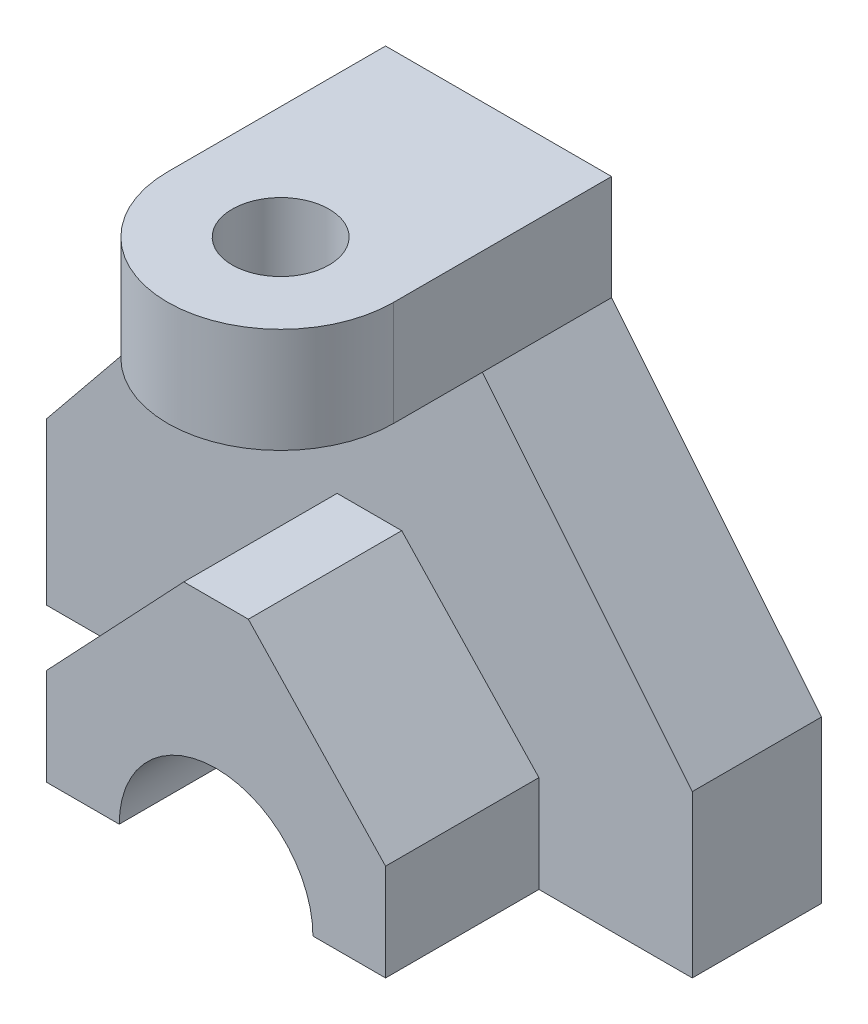
ISO-10303-21;
HEADER;
FILE_DESCRIPTION(('STEP AP214'),'2;1');
FILE_NAME('part.step','',(''),(''),'','','');
FILE_SCHEMA(('AUTOMOTIVE_DESIGN { 1 0 10303 214 1 1 1 1 }'));
ENDSEC;
DATA;
#1=APPLICATION_CONTEXT('core data for automotive mechanical design processes');
#2=APPLICATION_PROTOCOL_DEFINITION('international standard','automotive_design',2000,#1);
#3=PRODUCT_CONTEXT('',#1,'mechanical');
#4=PRODUCT('Part','Part','',(#3));
#5=PRODUCT_RELATED_PRODUCT_CATEGORY('part','',(#4));
#6=PRODUCT_DEFINITION_FORMATION('','',#4);
#7=PRODUCT_DEFINITION_CONTEXT('part definition',#1,'design');
#8=PRODUCT_DEFINITION('design','',#6,#7);
#9=PRODUCT_DEFINITION_SHAPE('','',#8);
#10=(LENGTH_UNIT() NAMED_UNIT(*) SI_UNIT(.MILLI.,.METRE.));
#11=(NAMED_UNIT(*) PLANE_ANGLE_UNIT() SI_UNIT($,.RADIAN.));
#12=(NAMED_UNIT(*) SI_UNIT($,.STERADIAN.) SOLID_ANGLE_UNIT());
#13=UNCERTAINTY_MEASURE_WITH_UNIT(LENGTH_MEASURE(1.E-05),#10,'distance_accuracy_value','');
#14=(GEOMETRIC_REPRESENTATION_CONTEXT(3) GLOBAL_UNCERTAINTY_ASSIGNED_CONTEXT((#13)) GLOBAL_UNIT_ASSIGNED_CONTEXT((#10,
#11,#12)) REPRESENTATION_CONTEXT('',''));
#15=CARTESIAN_POINT('',(0.,0.,0.));
#16=DIRECTION('',(0.,0.,1.));
#17=DIRECTION('',(1.,0.,0.));
#18=AXIS2_PLACEMENT_3D('',#15,#16,#17);
#19=CARTESIAN_POINT('',(0.,0.,16.));
#20=DIRECTION('',(0.,1.,0.));
#21=DIRECTION('',(0.,0.,1.));
#22=AXIS2_PLACEMENT_3D('',#19,#20,#21);
#23=PLANE('',#22);
#24=DIRECTION('',(1.,0.,0.));
#25=VECTOR('',#24,1.);
#26=CARTESIAN_POINT('',(0.,0.,0.));
#27=LINE('',#26,#25);
#28=CARTESIAN_POINT('',(-40.,0.,0.));
#29=VERTEX_POINT('',#28);
#30=CARTESIAN_POINT('',(-12.,0.,0.));
#31=VERTEX_POINT('',#30);
#32=EDGE_CURVE('E177',#29,#31,#27,.T.);
#33=ORIENTED_EDGE('',*,*,#32,.T.);
#34=DIRECTION('',(0.,0.,1.));
#35=VECTOR('',#34,1.);
#36=CARTESIAN_POINT('',(-12.,0.,0.));
#37=LINE('',#36,#35);
#38=CARTESIAN_POINT('',(-12.,0.,35.));
#39=VERTEX_POINT('',#38);
#40=EDGE_CURVE('E161',#31,#39,#37,.T.);
#41=ORIENTED_EDGE('',*,*,#40,.T.);
#42=DIRECTION('',(1.,0.,0.));
#43=VECTOR('',#42,1.);
#44=CARTESIAN_POINT('',(0.,0.,35.));
#45=LINE('',#44,#43);
#46=CARTESIAN_POINT('',(-21.,0.,35.));
#47=VERTEX_POINT('',#46);
#48=EDGE_CURVE('E305',#47,#39,#45,.T.);
#49=ORIENTED_EDGE('',*,*,#48,.F.);
#50=DIRECTION('',(0.,0.,-1.));
#51=VECTOR('',#50,1.);
#52=CARTESIAN_POINT('',(-21.,0.,35.));
#53=LINE('',#52,#51);
#54=CARTESIAN_POINT('',(-21.,0.,16.));
#55=VERTEX_POINT('',#54);
#56=EDGE_CURVE('E301',#47,#55,#53,.T.);
#57=ORIENTED_EDGE('',*,*,#56,.T.);
#58=DIRECTION('',(1.,0.,0.));
#59=VECTOR('',#58,1.);
#60=CARTESIAN_POINT('',(0.,0.,16.));
#61=LINE('',#60,#59);
#62=CARTESIAN_POINT('',(-40.,0.,16.));
#63=VERTEX_POINT('',#62);
#64=EDGE_CURVE('E199',#63,#55,#61,.T.);
#65=ORIENTED_EDGE('',*,*,#64,.F.);
#66=DIRECTION('',(0.,0.,-1.));
#67=VECTOR('',#66,1.);
#68=CARTESIAN_POINT('',(-40.,0.,16.));
#69=LINE('',#68,#67);
#70=EDGE_CURVE('E185',#63,#29,#69,.T.);
#71=ORIENTED_EDGE('',*,*,#70,.T.);
#72=EDGE_LOOP('',(#33,#41,#49,#57,#65,#71));
#73=FACE_BOUND('',#72,.T.);
#74=ADVANCED_FACE('F43',(#73),#23,.F.);
#75=CARTESIAN_POINT('',(0.,0.,16.));
#76=DIRECTION('',(0.,0.,1.));
#77=DIRECTION('',(1.,0.,0.));
#78=AXIS2_PLACEMENT_3D('',#75,#76,#77);
#79=PLANE('',#78);
#80=DIRECTION('',(0.,-1.,0.));
#81=VECTOR('',#80,1.);
#82=CARTESIAN_POINT('',(21.,0.,16.));
#83=LINE('',#82,#81);
#84=CARTESIAN_POINT('',(21.,12.,16.));
#85=VERTEX_POINT('',#84);
#86=CARTESIAN_POINT('',(21.,0.,16.));
#87=VERTEX_POINT('',#86);
#88=EDGE_CURVE('E343',#85,#87,#83,.T.);
#89=ORIENTED_EDGE('',*,*,#88,.T.);
#90=CARTESIAN_POINT('',(40.,0.,16.));
#91=VERTEX_POINT('',#90);
#92=EDGE_CURVE('E222',#87,#91,#61,.T.);
#93=ORIENTED_EDGE('',*,*,#92,.T.);
#94=DIRECTION('',(0.,-1.,0.));
#95=VECTOR('',#94,1.);
#96=CARTESIAN_POINT('',(40.,0.,16.));
#97=LINE('',#96,#95);
#98=CARTESIAN_POINT('',(40.,20.,16.));
#99=VERTEX_POINT('',#98);
#100=EDGE_CURVE('E237',#99,#91,#97,.T.);
#101=ORIENTED_EDGE('',*,*,#100,.F.);
#102=DIRECTION('',(0.630592625094466,-0.776114000116265,0.));
#103=VECTOR('',#102,1.);
#104=CARTESIAN_POINT('',(14.,52.,16.));
#105=LINE('',#104,#103);
#106=CARTESIAN_POINT('',(14.,52.,16.));
#107=VERTEX_POINT('',#106);
#108=EDGE_CURVE('E232',#107,#99,#105,.T.);
#109=ORIENTED_EDGE('',*,*,#108,.F.);
#110=DIRECTION('',(-1.,0.,0.));
#111=VECTOR('',#110,1.);
#112=CARTESIAN_POINT('',(0.,52.,16.));
#113=LINE('',#112,#111);
#114=CARTESIAN_POINT('',(-14.,52.,16.));
#115=VERTEX_POINT('',#114);
#116=EDGE_CURVE('E187',#107,#115,#113,.T.);
#117=ORIENTED_EDGE('',*,*,#116,.T.);
#118=DIRECTION('',(-0.630592625094466,-0.776114000116265,0.));
#119=VECTOR('',#118,1.);
#120=CARTESIAN_POINT('',(-14.,52.,16.));
#121=LINE('',#120,#119);
#122=CARTESIAN_POINT('',(-40.,20.,16.));
#123=VERTEX_POINT('',#122);
#124=EDGE_CURVE('E192',#115,#123,#121,.T.);
#125=ORIENTED_EDGE('',*,*,#124,.T.);
#126=DIRECTION('',(0.,-1.,0.));
#127=VECTOR('',#126,1.);
#128=CARTESIAN_POINT('',(-40.,0.,16.));
#129=LINE('',#128,#127);
#130=EDGE_CURVE('E206',#123,#63,#129,.T.);
#131=ORIENTED_EDGE('',*,*,#130,.T.);
#132=ORIENTED_EDGE('',*,*,#64,.T.);
#133=DIRECTION('',(0.,-1.,0.));
#134=VECTOR('',#133,1.);
#135=CARTESIAN_POINT('',(-21.,0.,16.));
#136=LINE('',#135,#134);
#137=CARTESIAN_POINT('',(-21.,12.,16.));
#138=VERTEX_POINT('',#137);
#139=EDGE_CURVE('E306',#138,#55,#136,.T.);
#140=ORIENTED_EDGE('',*,*,#139,.F.);
#141=DIRECTION('',(-0.686623532963716,-0.727013152549817,0.));
#142=VECTOR('',#141,1.);
#143=CARTESIAN_POINT('',(-21.,12.,16.));
#144=LINE('',#143,#142);
#145=CARTESIAN_POINT('',(-4.,30.,16.));
#146=VERTEX_POINT('',#145);
#147=EDGE_CURVE('E67',#146,#138,#144,.T.);
#148=ORIENTED_EDGE('',*,*,#147,.F.);
#149=DIRECTION('',(-1.,0.,0.));
#150=VECTOR('',#149,1.);
#151=CARTESIAN_POINT('',(0.,30.,16.));
#152=LINE('',#151,#150);
#153=CARTESIAN_POINT('',(4.,30.,16.));
#154=VERTEX_POINT('',#153);
#155=EDGE_CURVE('E313',#154,#146,#152,.T.);
#156=ORIENTED_EDGE('',*,*,#155,.F.);
#157=DIRECTION('',(0.686623532963716,-0.727013152549817,0.));
#158=VECTOR('',#157,1.);
#159=CARTESIAN_POINT('',(21.,12.,16.));
#160=LINE('',#159,#158);
#161=EDGE_CURVE('E338',#154,#85,#160,.T.);
#162=ORIENTED_EDGE('',*,*,#161,.T.);
#163=EDGE_LOOP('',(#89,#93,#101,#109,#117,#125,#131,#132,#140,#148,#156,#162));
#164=FACE_BOUND('',#163,.T.);
#165=ADVANCED_FACE('F385',(#164),#79,.T.);
#166=CARTESIAN_POINT('',(-14.,52.,16.));
#167=DIRECTION('',(0.776114000116266,-0.630592625094466,0.));
#168=DIRECTION('',(0.630592625094466,0.776114000116266,0.));
#169=AXIS2_PLACEMENT_3D('',#166,#167,#168);
#170=PLANE('',#169);
#171=DIRECTION('',(-0.630592625094466,-0.776114000116265,0.));
#172=VECTOR('',#171,1.);
#173=CARTESIAN_POINT('',(-14.,52.,0.));
#174=LINE('',#173,#172);
#175=CARTESIAN_POINT('',(-14.,52.,0.));
#176=VERTEX_POINT('',#175);
#177=CARTESIAN_POINT('',(-40.,20.,0.));
#178=VERTEX_POINT('',#177);
#179=EDGE_CURVE('E211',#176,#178,#174,.T.);
#180=ORIENTED_EDGE('',*,*,#179,.T.);
#181=DIRECTION('',(0.,0.,-1.));
#182=VECTOR('',#181,1.);
#183=CARTESIAN_POINT('',(-40.,20.,16.));
#184=LINE('',#183,#182);
#185=EDGE_CURVE('E52',#123,#178,#184,.T.);
#186=ORIENTED_EDGE('',*,*,#185,.F.);
#187=ORIENTED_EDGE('',*,*,#124,.F.);
#188=DIRECTION('',(0.,0.,-1.));
#189=VECTOR('',#188,1.);
#190=CARTESIAN_POINT('',(-14.,52.,16.));
#191=LINE('',#190,#189);
#192=EDGE_CURVE('E11',#115,#176,#191,.T.);
#193=ORIENTED_EDGE('',*,*,#192,.T.);
#194=EDGE_LOOP('',(#180,#186,#187,#193));
#195=FACE_BOUND('',#194,.T.);
#196=ADVANCED_FACE('F45',(#195),#170,.F.);
#197=CARTESIAN_POINT('',(-40.,0.,16.));
#198=DIRECTION('',(1.,0.,0.));
#199=DIRECTION('',(0.,0.,-1.));
#200=AXIS2_PLACEMENT_3D('',#197,#198,#199);
#201=PLANE('',#200);
#202=DIRECTION('',(0.,-1.,0.));
#203=VECTOR('',#202,1.);
#204=CARTESIAN_POINT('',(-40.,0.,0.));
#205=LINE('',#204,#203);
#206=EDGE_CURVE('E194',#178,#29,#205,.T.);
#207=ORIENTED_EDGE('',*,*,#206,.T.);
#208=ORIENTED_EDGE('',*,*,#70,.F.);
#209=ORIENTED_EDGE('',*,*,#130,.F.);
#210=ORIENTED_EDGE('',*,*,#185,.T.);
#211=EDGE_LOOP('',(#207,#208,#209,#210));
#212=FACE_BOUND('',#211,.T.);
#213=ADVANCED_FACE('F205',(#212),#201,.F.);
#214=CARTESIAN_POINT('',(12.,0.,35.));
#215=VERTEX_POINT('',#214);
#216=CARTESIAN_POINT('',(21.,0.,35.));
#217=VERTEX_POINT('',#216);
#218=EDGE_CURVE('E319',#215,#217,#45,.T.);
#219=ORIENTED_EDGE('',*,*,#218,.F.);
#220=DIRECTION('',(0.,0.,1.));
#221=VECTOR('',#220,1.);
#222=CARTESIAN_POINT('',(12.,0.,0.));
#223=LINE('',#222,#221);
#224=CARTESIAN_POINT('',(12.,0.,0.));
#225=VERTEX_POINT('',#224);
#226=EDGE_CURVE('E59',#225,#215,#223,.T.);
#227=ORIENTED_EDGE('',*,*,#226,.F.);
#228=CARTESIAN_POINT('',(40.,0.,0.));
#229=VERTEX_POINT('',#228);
#230=EDGE_CURVE('E179',#225,#229,#27,.T.);
#231=ORIENTED_EDGE('',*,*,#230,.T.);
#232=DIRECTION('',(0.,0.,-1.));
#233=VECTOR('',#232,1.);
#234=CARTESIAN_POINT('',(40.,0.,16.));
#235=LINE('',#234,#233);
#236=EDGE_CURVE('E214',#91,#229,#235,.T.);
#237=ORIENTED_EDGE('',*,*,#236,.F.);
#238=ORIENTED_EDGE('',*,*,#92,.F.);
#239=DIRECTION('',(0.,0.,-1.));
#240=VECTOR('',#239,1.);
#241=CARTESIAN_POINT('',(21.,0.,35.));
#242=LINE('',#241,#240);
#243=EDGE_CURVE('E316',#217,#87,#242,.T.);
#244=ORIENTED_EDGE('',*,*,#243,.F.);
#245=EDGE_LOOP('',(#219,#227,#231,#237,#238,#244));
#246=FACE_BOUND('',#245,.T.);
#247=ADVANCED_FACE('F365',(#246),#23,.F.);
#248=CARTESIAN_POINT('',(0.,0.,0.));
#249=DIRECTION('',(0.,0.,1.));
#250=DIRECTION('',(1.,0.,0.));
#251=AXIS2_PLACEMENT_3D('',#248,#249,#250);
#252=PLANE('',#251);
#253=ORIENTED_EDGE('',*,*,#230,.F.);
#254=CARTESIAN_POINT('',(0.,0.,0.));
#255=DIRECTION('',(0.,0.,1.));
#256=DIRECTION('',(1.,0.,0.));
#257=AXIS2_PLACEMENT_3D('',#254,#255,#256);
#258=CIRCLE('',#257,12.);
#259=EDGE_CURVE('E164',#225,#31,#258,.T.);
#260=ORIENTED_EDGE('',*,*,#259,.T.);
#261=ORIENTED_EDGE('',*,*,#32,.F.);
#262=ORIENTED_EDGE('',*,*,#206,.F.);
#263=ORIENTED_EDGE('',*,*,#179,.F.);
#264=DIRECTION('',(0.,-1.,0.));
#265=VECTOR('',#264,1.);
#266=CARTESIAN_POINT('',(-14.,65.,0.));
#267=LINE('',#266,#265);
#268=CARTESIAN_POINT('',(-14.,65.,0.));
#269=VERTEX_POINT('',#268);
#270=EDGE_CURVE('E241',#269,#176,#267,.T.);
#271=ORIENTED_EDGE('',*,*,#270,.F.);
#272=DIRECTION('',(-1.,0.,0.));
#273=VECTOR('',#272,1.);
#274=CARTESIAN_POINT('',(-14.,65.,0.));
#275=LINE('',#274,#273);
#276=CARTESIAN_POINT('',(14.,65.,0.));
#277=VERTEX_POINT('',#276);
#278=EDGE_CURVE('E267',#277,#269,#275,.T.);
#279=ORIENTED_EDGE('',*,*,#278,.F.);
#280=DIRECTION('',(0.,-1.,0.));
#281=VECTOR('',#280,1.);
#282=CARTESIAN_POINT('',(14.,65.,0.));
#283=LINE('',#282,#281);
#284=CARTESIAN_POINT('',(14.,52.,0.));
#285=VERTEX_POINT('',#284);
#286=EDGE_CURVE('E258',#277,#285,#283,.T.);
#287=ORIENTED_EDGE('',*,*,#286,.T.);
#288=DIRECTION('',(0.630592625094466,-0.776114000116265,0.));
#289=VECTOR('',#288,1.);
#290=CARTESIAN_POINT('',(14.,52.,0.));
#291=LINE('',#290,#289);
#292=CARTESIAN_POINT('',(40.,20.,0.));
#293=VERTEX_POINT('',#292);
#294=EDGE_CURVE('E233',#285,#293,#291,.T.);
#295=ORIENTED_EDGE('',*,*,#294,.T.);
#296=DIRECTION('',(0.,-1.,0.));
#297=VECTOR('',#296,1.);
#298=CARTESIAN_POINT('',(40.,0.,0.));
#299=LINE('',#298,#297);
#300=EDGE_CURVE('E238',#293,#229,#299,.T.);
#301=ORIENTED_EDGE('',*,*,#300,.T.);
#302=EDGE_LOOP('',(#253,#260,#261,#262,#263,#271,#279,#287,#295,#301));
#303=FACE_BOUND('',#302,.T.);
#304=ADVANCED_FACE('F175',(#303),#252,.F.);
#305=CARTESIAN_POINT('',(40.,0.,16.));
#306=DIRECTION('',(1.,0.,0.));
#307=DIRECTION('',(0.,0.,-1.));
#308=AXIS2_PLACEMENT_3D('',#305,#306,#307);
#309=PLANE('',#308);
#310=ORIENTED_EDGE('',*,*,#300,.F.);
#311=DIRECTION('',(0.,0.,-1.));
#312=VECTOR('',#311,1.);
#313=CARTESIAN_POINT('',(40.,20.,16.));
#314=LINE('',#313,#312);
#315=EDGE_CURVE('E217',#99,#293,#314,.T.);
#316=ORIENTED_EDGE('',*,*,#315,.F.);
#317=ORIENTED_EDGE('',*,*,#100,.T.);
#318=ORIENTED_EDGE('',*,*,#236,.T.);
#319=EDGE_LOOP('',(#310,#316,#317,#318));
#320=FACE_BOUND('',#319,.T.);
#321=ADVANCED_FACE('F413',(#320),#309,.T.);
#322=CARTESIAN_POINT('',(14.,52.,16.));
#323=DIRECTION('',(0.776114000116266,0.630592625094466,0.));
#324=DIRECTION('',(-0.630592625094466,0.776114000116266,0.));
#325=AXIS2_PLACEMENT_3D('',#322,#323,#324);
#326=PLANE('',#325);
#327=ORIENTED_EDGE('',*,*,#294,.F.);
#328=DIRECTION('',(0.,0.,-1.));
#329=VECTOR('',#328,1.);
#330=CARTESIAN_POINT('',(14.,52.,16.));
#331=LINE('',#330,#329);
#332=EDGE_CURVE('E229',#107,#285,#331,.T.);
#333=ORIENTED_EDGE('',*,*,#332,.F.);
#334=ORIENTED_EDGE('',*,*,#108,.T.);
#335=ORIENTED_EDGE('',*,*,#315,.T.);
#336=EDGE_LOOP('',(#327,#333,#334,#335));
#337=FACE_BOUND('',#336,.T.);
#338=ADVANCED_FACE('F409',(#337),#326,.T.);
#339=CARTESIAN_POINT('',(-14.,65.,0.));
#340=DIRECTION('',(1.,0.,0.));
#341=DIRECTION('',(0.,0.,-1.));
#342=AXIS2_PLACEMENT_3D('',#339,#340,#341);
#343=PLANE('',#342);
#344=ORIENTED_EDGE('',*,*,#192,.F.);
#345=DIRECTION('',(0.,0.,1.));
#346=VECTOR('',#345,1.);
#347=CARTESIAN_POINT('',(-14.,52.,0.));
#348=LINE('',#347,#346);
#349=CARTESIAN_POINT('',(-14.,52.,27.));
#350=VERTEX_POINT('',#349);
#351=EDGE_CURVE('E271',#115,#350,#348,.T.);
#352=ORIENTED_EDGE('',*,*,#351,.T.);
#353=DIRECTION('',(0.,-1.,0.));
#354=VECTOR('',#353,1.);
#355=CARTESIAN_POINT('',(-14.,65.,27.));
#356=LINE('',#355,#354);
#357=CARTESIAN_POINT('',(-14.,65.,27.));
#358=VERTEX_POINT('',#357);
#359=EDGE_CURVE('E250',#358,#350,#356,.T.);
#360=ORIENTED_EDGE('',*,*,#359,.F.);
#361=DIRECTION('',(0.,0.,1.));
#362=VECTOR('',#361,1.);
#363=CARTESIAN_POINT('',(-14.,65.,0.));
#364=LINE('',#363,#362);
#365=EDGE_CURVE('E280',#269,#358,#364,.T.);
#366=ORIENTED_EDGE('',*,*,#365,.F.);
#367=ORIENTED_EDGE('',*,*,#270,.T.);
#368=EDGE_LOOP('',(#344,#352,#360,#366,#367));
#369=FACE_BOUND('',#368,.T.);
#370=ADVANCED_FACE('F389',(#369),#343,.F.);
#371=CARTESIAN_POINT('',(0.,65.,27.));
#372=DIRECTION('',(0.,-1.,0.));
#373=DIRECTION('',(0.,0.,-1.));
#374=AXIS2_PLACEMENT_3D('',#371,#372,#373);
#375=CYLINDRICAL_SURFACE('',#374,14.);
#376=CARTESIAN_POINT('',(0.,52.,27.));
#377=DIRECTION('',(0.,1.,0.));
#378=DIRECTION('',(0.,0.,1.));
#379=AXIS2_PLACEMENT_3D('',#376,#377,#378);
#380=CIRCLE('',#379,14.);
#381=CARTESIAN_POINT('',(14.,52.,27.));
#382=VERTEX_POINT('',#381);
#383=EDGE_CURVE('E268',#350,#382,#380,.T.);
#384=ORIENTED_EDGE('',*,*,#383,.T.);
#385=DIRECTION('',(0.,-1.,0.));
#386=VECTOR('',#385,1.);
#387=CARTESIAN_POINT('',(14.,65.,27.));
#388=LINE('',#387,#386);
#389=CARTESIAN_POINT('',(14.,65.,27.));
#390=VERTEX_POINT('',#389);
#391=EDGE_CURVE('E254',#390,#382,#388,.T.);
#392=ORIENTED_EDGE('',*,*,#391,.F.);
#393=CARTESIAN_POINT('',(0.,65.,27.));
#394=DIRECTION('',(0.,1.,0.));
#395=DIRECTION('',(0.,0.,1.));
#396=AXIS2_PLACEMENT_3D('',#393,#394,#395);
#397=CIRCLE('',#396,14.);
#398=EDGE_CURVE('E277',#358,#390,#397,.T.);
#399=ORIENTED_EDGE('',*,*,#398,.F.);
#400=ORIENTED_EDGE('',*,*,#359,.T.);
#401=EDGE_LOOP('',(#384,#392,#399,#400));
#402=FACE_BOUND('',#401,.T.);
#403=ADVANCED_FACE('F397',(#402),#375,.T.);
#404=CARTESIAN_POINT('',(14.,65.,0.));
#405=DIRECTION('',(-1.,0.,0.));
#406=DIRECTION('',(0.,0.,1.));
#407=AXIS2_PLACEMENT_3D('',#404,#405,#406);
#408=PLANE('',#407);
#409=DIRECTION('',(0.,0.,-1.));
#410=VECTOR('',#409,1.);
#411=CARTESIAN_POINT('',(14.,52.,0.));
#412=LINE('',#411,#410);
#413=EDGE_CURVE('E263',#382,#107,#412,.T.);
#414=ORIENTED_EDGE('',*,*,#413,.T.);
#415=ORIENTED_EDGE('',*,*,#332,.T.);
#416=ORIENTED_EDGE('',*,*,#286,.F.);
#417=DIRECTION('',(0.,0.,-1.));
#418=VECTOR('',#417,1.);
#419=CARTESIAN_POINT('',(14.,65.,0.));
#420=LINE('',#419,#418);
#421=EDGE_CURVE('E262',#390,#277,#420,.T.);
#422=ORIENTED_EDGE('',*,*,#421,.F.);
#423=ORIENTED_EDGE('',*,*,#391,.T.);
#424=EDGE_LOOP('',(#414,#415,#416,#422,#423));
#425=FACE_BOUND('',#424,.T.);
#426=ADVANCED_FACE('F401',(#425),#408,.F.);
#427=CARTESIAN_POINT('',(0.,65.,27.));
#428=DIRECTION('',(0.,1.,0.));
#429=DIRECTION('',(0.,0.,1.));
#430=AXIS2_PLACEMENT_3D('',#427,#428,#429);
#431=PLANE('',#430);
#432=CARTESIAN_POINT('',(0.,65.,27.));
#433=DIRECTION('',(0.,1.,0.));
#434=DIRECTION('',(0.,0.,1.));
#435=AXIS2_PLACEMENT_3D('',#432,#433,#434);
#436=CIRCLE('',#435,6.);
#437=CARTESIAN_POINT('',(0.,65.,33.));
#438=VERTEX_POINT('',#437);
#439=EDGE_CURVE('E286',#438,#438,#436,.T.);
#440=ORIENTED_EDGE('',*,*,#439,.F.);
#441=EDGE_LOOP('',(#440));
#442=FACE_BOUND('',#441,.T.);
#443=ORIENTED_EDGE('',*,*,#278,.T.);
#444=ORIENTED_EDGE('',*,*,#365,.T.);
#445=ORIENTED_EDGE('',*,*,#398,.T.);
#446=ORIENTED_EDGE('',*,*,#421,.T.);
#447=EDGE_LOOP('',(#443,#444,#445,#446));
#448=FACE_BOUND('',#447,.T.);
#449=ADVANCED_FACE('F406',(#442,#448),#431,.T.);
#450=CARTESIAN_POINT('',(0.,52.,27.));
#451=DIRECTION('',(0.,1.,0.));
#452=DIRECTION('',(0.,0.,1.));
#453=AXIS2_PLACEMENT_3D('',#450,#451,#452);
#454=PLANE('',#453);
#455=CARTESIAN_POINT('',(0.,52.,27.));
#456=DIRECTION('',(0.,1.,0.));
#457=DIRECTION('',(0.,0.,1.));
#458=AXIS2_PLACEMENT_3D('',#455,#456,#457);
#459=CIRCLE('',#458,6.);
#460=CARTESIAN_POINT('',(0.,52.,33.));
#461=VERTEX_POINT('',#460);
#462=EDGE_CURVE('E274',#461,#461,#459,.T.);
#463=ORIENTED_EDGE('',*,*,#462,.T.);
#464=EDGE_LOOP('',(#463));
#465=FACE_BOUND('',#464,.T.);
#466=ORIENTED_EDGE('',*,*,#116,.F.);
#467=ORIENTED_EDGE('',*,*,#413,.F.);
#468=ORIENTED_EDGE('',*,*,#383,.F.);
#469=ORIENTED_EDGE('',*,*,#351,.F.);
#470=EDGE_LOOP('',(#466,#467,#468,#469));
#471=FACE_BOUND('',#470,.T.);
#472=ADVANCED_FACE('F393',(#465,#471),#454,.F.);
#473=CARTESIAN_POINT('',(0.,52.,27.));
#474=DIRECTION('',(0.,1.,0.));
#475=DIRECTION('',(0.,0.,1.));
#476=AXIS2_PLACEMENT_3D('',#473,#474,#475);
#477=CYLINDRICAL_SURFACE('',#476,6.);
#478=CARTESIAN_POINT('',(0.,52.,33.));
#479=CARTESIAN_POINT('',(0.,52.1354166666667,33.));
#480=CARTESIAN_POINT('',(0.,52.2708333333333,33.));
#481=CARTESIAN_POINT('',(0.,52.5416666666667,33.));
#482=CARTESIAN_POINT('',(0.,52.6770833333333,33.));
#483=CARTESIAN_POINT('',(0.,52.9479166666667,33.));
#484=CARTESIAN_POINT('',(0.,53.0833333333333,33.));
#485=CARTESIAN_POINT('',(0.,53.3541666666667,33.));
#486=CARTESIAN_POINT('',(0.,53.4895833333333,33.));
#487=CARTESIAN_POINT('',(0.,53.7604166666667,33.));
#488=CARTESIAN_POINT('',(0.,53.8958333333333,33.));
#489=CARTESIAN_POINT('',(0.,54.1666666666667,33.));
#490=CARTESIAN_POINT('',(0.,54.3020833333333,33.));
#491=CARTESIAN_POINT('',(0.,54.5729166666667,33.));
#492=CARTESIAN_POINT('',(0.,54.7083333333333,33.));
#493=CARTESIAN_POINT('',(0.,54.9791666666667,33.));
#494=CARTESIAN_POINT('',(0.,55.1145833333333,33.));
#495=CARTESIAN_POINT('',(0.,55.3854166666667,33.));
#496=CARTESIAN_POINT('',(0.,55.5208333333333,33.));
#497=CARTESIAN_POINT('',(0.,55.7916666666667,33.));
#498=CARTESIAN_POINT('',(0.,55.9270833333333,33.));
#499=CARTESIAN_POINT('',(0.,56.1979166666667,33.));
#500=CARTESIAN_POINT('',(0.,56.3333333333333,33.));
#501=CARTESIAN_POINT('',(0.,56.6041666666667,33.));
#502=CARTESIAN_POINT('',(0.,56.7395833333333,33.));
#503=CARTESIAN_POINT('',(0.,57.0104166666667,33.));
#504=CARTESIAN_POINT('',(0.,57.1458333333333,33.));
#505=CARTESIAN_POINT('',(0.,57.4166666666667,33.));
#506=CARTESIAN_POINT('',(0.,57.5520833333333,33.));
#507=CARTESIAN_POINT('',(0.,57.8229166666667,33.));
#508=CARTESIAN_POINT('',(0.,57.9583333333333,33.));
#509=CARTESIAN_POINT('',(0.,58.2291666666667,33.));
#510=CARTESIAN_POINT('',(0.,58.3645833333333,33.));
#511=CARTESIAN_POINT('',(0.,58.6354166666667,33.));
#512=CARTESIAN_POINT('',(0.,58.7708333333333,33.));
#513=CARTESIAN_POINT('',(0.,59.0416666666667,33.));
#514=CARTESIAN_POINT('',(0.,59.1770833333333,33.));
#515=CARTESIAN_POINT('',(0.,59.4479166666667,33.));
#516=CARTESIAN_POINT('',(0.,59.5833333333333,33.));
#517=CARTESIAN_POINT('',(0.,59.8541666666667,33.));
#518=CARTESIAN_POINT('',(0.,59.9895833333333,33.));
#519=CARTESIAN_POINT('',(0.,60.2604166666667,33.));
#520=CARTESIAN_POINT('',(0.,60.3958333333333,33.));
#521=CARTESIAN_POINT('',(0.,60.6666666666667,33.));
#522=CARTESIAN_POINT('',(0.,60.8020833333333,33.));
#523=CARTESIAN_POINT('',(0.,61.0729166666667,33.));
#524=CARTESIAN_POINT('',(0.,61.2083333333333,33.));
#525=CARTESIAN_POINT('',(0.,61.4791666666667,33.));
#526=CARTESIAN_POINT('',(0.,61.6145833333333,33.));
#527=CARTESIAN_POINT('',(0.,61.8854166666667,33.));
#528=CARTESIAN_POINT('',(0.,62.0208333333333,33.));
#529=CARTESIAN_POINT('',(0.,62.2916666666667,33.));
#530=CARTESIAN_POINT('',(0.,62.4270833333333,33.));
#531=CARTESIAN_POINT('',(0.,62.6979166666667,33.));
#532=CARTESIAN_POINT('',(0.,62.8333333333333,33.));
#533=CARTESIAN_POINT('',(0.,63.1041666666667,33.));
#534=CARTESIAN_POINT('',(0.,63.2395833333333,33.));
#535=CARTESIAN_POINT('',(0.,63.5104166666667,33.));
#536=CARTESIAN_POINT('',(0.,63.6458333333333,33.));
#537=CARTESIAN_POINT('',(0.,63.9166666666667,33.));
#538=CARTESIAN_POINT('',(0.,64.0520833333333,33.));
#539=CARTESIAN_POINT('',(0.,64.3229166666667,33.));
#540=CARTESIAN_POINT('',(0.,64.4583333333333,33.));
#541=CARTESIAN_POINT('',(0.,64.7291666666667,33.));
#542=CARTESIAN_POINT('',(0.,64.8645833333333,33.));
#543=CARTESIAN_POINT('',(0.,65.,33.));
#544=B_SPLINE_CURVE_WITH_KNOTS('',3,(#478,#479,#480,#481,#482,#483,#484,#485,#486,#487,#488,
#489,#490,#491,#492,#493,#494,#495,#496,#497,#498,#499,#500,#501,#502,#503,#504,#505,#506,#507,
#508,#509,#510,#511,#512,#513,#514,#515,#516,#517,#518,#519,#520,#521,#522,#523,#524,#525,#526,
#527,#528,#529,#530,#531,#532,#533,#534,#535,#536,#537,#538,#539,#540,#541,#542,#543),
.UNSPECIFIED.,.F.,.F.,(4,2,2,2,2,2,2,2,2,2,2,2,2,2,2,2,2,2,2,2,2,2,2,2,2,2,2,2,2,2,2,2,4),(0.,
0.406249999999997,0.812499999999994,1.21875,1.62499999999999,2.03125,2.4375,2.84374999999999,
3.25,3.65624999999999,4.0625,4.46874999999999,4.87499999999999,5.28124999999999,
5.68749999999999,6.09374999999999,6.49999999999999,6.90624999999999,7.31249999999999,
7.71874999999999,8.12499999999999,8.53124999999999,8.93749999999999,9.34374999999999,
9.74999999999999,10.15625,10.5625,10.96875,11.375,11.78125,12.1875,12.59375,13.),.UNSPECIFIED.);
#545=EDGE_CURVE('BSEAM459',#461,#438,#544,.T.);
#546=ORIENTED_EDGE('',*,*,#462,.F.);
#547=ORIENTED_EDGE('',*,*,#439,.T.);
#548=ORIENTED_EDGE('',*,*,#545,.T.);
#549=ORIENTED_EDGE('',*,*,#545,.F.);
#550=EDGE_LOOP('',(#546,#548,#547,#549));
#551=FACE_BOUND('',#550,.T.);
#552=ADVANCED_FACE('F459',(#551),#477,.F.);
#553=CARTESIAN_POINT('',(0.,30.,35.));
#554=DIRECTION('',(0.,-1.,0.));
#555=DIRECTION('',(0.,0.,-1.));
#556=AXIS2_PLACEMENT_3D('',#553,#554,#555);
#557=PLANE('',#556);
#558=ORIENTED_EDGE('',*,*,#155,.T.);
#559=DIRECTION('',(0.,0.,-1.));
#560=VECTOR('',#559,1.);
#561=CARTESIAN_POINT('',(-4.,30.,35.));
#562=LINE('',#561,#560);
#563=CARTESIAN_POINT('',(-4.,30.,35.));
#564=VERTEX_POINT('',#563);
#565=EDGE_CURVE('E290',#564,#146,#562,.T.);
#566=ORIENTED_EDGE('',*,*,#565,.F.);
#567=DIRECTION('',(-1.,0.,0.));
#568=VECTOR('',#567,1.);
#569=CARTESIAN_POINT('',(0.,30.,35.));
#570=LINE('',#569,#568);
#571=CARTESIAN_POINT('',(4.,30.,35.));
#572=VERTEX_POINT('',#571);
#573=EDGE_CURVE('E310',#572,#564,#570,.T.);
#574=ORIENTED_EDGE('',*,*,#573,.F.);
#575=DIRECTION('',(0.,0.,-1.));
#576=VECTOR('',#575,1.);
#577=CARTESIAN_POINT('',(4.,30.,35.));
#578=LINE('',#577,#576);
#579=EDGE_CURVE('E333',#572,#154,#578,.T.);
#580=ORIENTED_EDGE('',*,*,#579,.T.);
#581=EDGE_LOOP('',(#558,#566,#574,#580));
#582=FACE_BOUND('',#581,.T.);
#583=ADVANCED_FACE('F378',(#582),#557,.F.);
#584=CARTESIAN_POINT('',(-21.,12.,35.));
#585=DIRECTION('',(0.727013152549818,-0.686623532963716,0.));
#586=DIRECTION('',(0.686623532963716,0.727013152549818,0.));
#587=AXIS2_PLACEMENT_3D('',#584,#585,#586);
#588=PLANE('',#587);
#589=ORIENTED_EDGE('',*,*,#147,.T.);
#590=DIRECTION('',(0.,0.,-1.));
#591=VECTOR('',#590,1.);
#592=CARTESIAN_POINT('',(-21.,12.,35.));
#593=LINE('',#592,#591);
#594=CARTESIAN_POINT('',(-21.,12.,35.));
#595=VERTEX_POINT('',#594);
#596=EDGE_CURVE('E297',#595,#138,#593,.T.);
#597=ORIENTED_EDGE('',*,*,#596,.F.);
#598=DIRECTION('',(-0.686623532963716,-0.727013152549817,0.));
#599=VECTOR('',#598,1.);
#600=CARTESIAN_POINT('',(-21.,12.,35.));
#601=LINE('',#600,#599);
#602=EDGE_CURVE('E323',#564,#595,#601,.T.);
#603=ORIENTED_EDGE('',*,*,#602,.F.);
#604=ORIENTED_EDGE('',*,*,#565,.T.);
#605=EDGE_LOOP('',(#589,#597,#603,#604));
#606=FACE_BOUND('',#605,.T.);
#607=ADVANCED_FACE('F380',(#606),#588,.F.);
#608=CARTESIAN_POINT('',(-21.,0.,35.));
#609=DIRECTION('',(1.,0.,0.));
#610=DIRECTION('',(0.,0.,-1.));
#611=AXIS2_PLACEMENT_3D('',#608,#609,#610);
#612=PLANE('',#611);
#613=ORIENTED_EDGE('',*,*,#139,.T.);
#614=ORIENTED_EDGE('',*,*,#56,.F.);
#615=DIRECTION('',(0.,-1.,0.));
#616=VECTOR('',#615,1.);
#617=CARTESIAN_POINT('',(-21.,0.,35.));
#618=LINE('',#617,#616);
#619=EDGE_CURVE('E320',#595,#47,#618,.T.);
#620=ORIENTED_EDGE('',*,*,#619,.F.);
#621=ORIENTED_EDGE('',*,*,#596,.T.);
#622=EDGE_LOOP('',(#613,#614,#620,#621));
#623=FACE_BOUND('',#622,.T.);
#624=ADVANCED_FACE('F384',(#623),#612,.F.);
#625=CARTESIAN_POINT('',(0.,0.,35.));
#626=DIRECTION('',(0.,0.,1.));
#627=DIRECTION('',(1.,0.,0.));
#628=AXIS2_PLACEMENT_3D('',#625,#626,#627);
#629=PLANE('',#628);
#630=CARTESIAN_POINT('',(0.,0.,35.));
#631=DIRECTION('',(0.,0.,1.));
#632=DIRECTION('',(1.,0.,0.));
#633=AXIS2_PLACEMENT_3D('',#630,#631,#632);
#634=CIRCLE('',#633,12.);
#635=EDGE_CURVE('E165',#215,#39,#634,.T.);
#636=ORIENTED_EDGE('',*,*,#635,.F.);
#637=ORIENTED_EDGE('',*,*,#218,.T.);
#638=DIRECTION('',(0.,-1.,0.));
#639=VECTOR('',#638,1.);
#640=CARTESIAN_POINT('',(21.,0.,35.));
#641=LINE('',#640,#639);
#642=CARTESIAN_POINT('',(21.,12.,35.));
#643=VERTEX_POINT('',#642);
#644=EDGE_CURVE('E342',#643,#217,#641,.T.);
#645=ORIENTED_EDGE('',*,*,#644,.F.);
#646=DIRECTION('',(0.686623532963716,-0.727013152549817,0.));
#647=VECTOR('',#646,1.);
#648=CARTESIAN_POINT('',(21.,12.,35.));
#649=LINE('',#648,#647);
#650=EDGE_CURVE('E337',#572,#643,#649,.T.);
#651=ORIENTED_EDGE('',*,*,#650,.F.);
#652=ORIENTED_EDGE('',*,*,#573,.T.);
#653=ORIENTED_EDGE('',*,*,#602,.T.);
#654=ORIENTED_EDGE('',*,*,#619,.T.);
#655=ORIENTED_EDGE('',*,*,#48,.T.);
#656=EDGE_LOOP('',(#636,#637,#645,#651,#652,#653,#654,#655));
#657=FACE_BOUND('',#656,.T.);
#658=ADVANCED_FACE('F361',(#657),#629,.T.);
#659=CARTESIAN_POINT('',(21.,0.,35.));
#660=DIRECTION('',(1.,0.,0.));
#661=DIRECTION('',(0.,0.,-1.));
#662=AXIS2_PLACEMENT_3D('',#659,#660,#661);
#663=PLANE('',#662);
#664=ORIENTED_EDGE('',*,*,#88,.F.);
#665=DIRECTION('',(0.,0.,-1.));
#666=VECTOR('',#665,1.);
#667=CARTESIAN_POINT('',(21.,12.,35.));
#668=LINE('',#667,#666);
#669=EDGE_CURVE('E330',#643,#85,#668,.T.);
#670=ORIENTED_EDGE('',*,*,#669,.F.);
#671=ORIENTED_EDGE('',*,*,#644,.T.);
#672=ORIENTED_EDGE('',*,*,#243,.T.);
#673=EDGE_LOOP('',(#664,#670,#671,#672));
#674=FACE_BOUND('',#673,.T.);
#675=ADVANCED_FACE('F369',(#674),#663,.T.);
#676=CARTESIAN_POINT('',(21.,12.,35.));
#677=DIRECTION('',(0.727013152549818,0.686623532963716,0.));
#678=DIRECTION('',(-0.686623532963716,0.727013152549818,0.));
#679=AXIS2_PLACEMENT_3D('',#676,#677,#678);
#680=PLANE('',#679);
#681=ORIENTED_EDGE('',*,*,#161,.F.);
#682=ORIENTED_EDGE('',*,*,#579,.F.);
#683=ORIENTED_EDGE('',*,*,#650,.T.);
#684=ORIENTED_EDGE('',*,*,#669,.T.);
#685=EDGE_LOOP('',(#681,#682,#683,#684));
#686=FACE_BOUND('',#685,.T.);
#687=ADVANCED_FACE('F372',(#686),#680,.T.);
#688=CARTESIAN_POINT('',(0.,0.,0.));
#689=DIRECTION('',(0.,0.,1.));
#690=DIRECTION('',(1.,0.,0.));
#691=AXIS2_PLACEMENT_3D('',#688,#689,#690);
#692=CYLINDRICAL_SURFACE('',#691,12.);
#693=ORIENTED_EDGE('',*,*,#635,.T.);
#694=ORIENTED_EDGE('',*,*,#40,.F.);
#695=ORIENTED_EDGE('',*,*,#259,.F.);
#696=ORIENTED_EDGE('',*,*,#226,.T.);
#697=EDGE_LOOP('',(#693,#694,#695,#696));
#698=FACE_BOUND('',#697,.T.);
#699=ADVANCED_FACE('F163',(#698),#692,.F.);
#700=CLOSED_SHELL('',(#74,#165,#196,#213,#247,#304,#321,#338,#370,#403,#426,#449,#472,#552,#583,
#607,#624,#658,#675,#687,#699));
#701=MANIFOLD_SOLID_BREP('B2',#700);
#702=ADVANCED_BREP_SHAPE_REPRESENTATION('',(#18,#701),#14);
#703=SHAPE_DEFINITION_REPRESENTATION(#9,#702);
ENDSEC;
END-ISO-10303-21;
